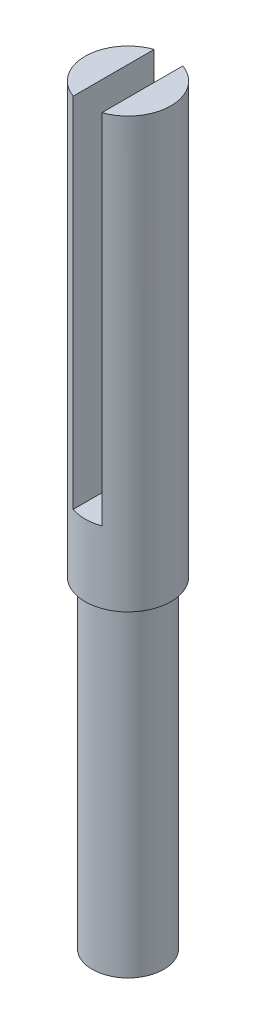
ISO-10303-21;
HEADER;
FILE_DESCRIPTION(('STEP AP214'),'2;1');
FILE_NAME('part.step','',(''),(''),'','','');
FILE_SCHEMA(('AUTOMOTIVE_DESIGN { 1 0 10303 214 1 1 1 1 }'));
ENDSEC;
DATA;
#1=APPLICATION_CONTEXT('core data for automotive mechanical design processes');
#2=APPLICATION_PROTOCOL_DEFINITION('international standard','automotive_design',2000,#1);
#3=PRODUCT_CONTEXT('',#1,'mechanical');
#4=PRODUCT('Part','Part','',(#3));
#5=PRODUCT_RELATED_PRODUCT_CATEGORY('part','',(#4));
#6=PRODUCT_DEFINITION_FORMATION('','',#4);
#7=PRODUCT_DEFINITION_CONTEXT('part definition',#1,'design');
#8=PRODUCT_DEFINITION('design','',#6,#7);
#9=PRODUCT_DEFINITION_SHAPE('','',#8);
#10=(LENGTH_UNIT() NAMED_UNIT(*) SI_UNIT(.MILLI.,.METRE.));
#11=(NAMED_UNIT(*) PLANE_ANGLE_UNIT() SI_UNIT($,.RADIAN.));
#12=(NAMED_UNIT(*) SI_UNIT($,.STERADIAN.) SOLID_ANGLE_UNIT());
#13=UNCERTAINTY_MEASURE_WITH_UNIT(LENGTH_MEASURE(1.E-05),#10,'distance_accuracy_value','');
#14=(GEOMETRIC_REPRESENTATION_CONTEXT(3) GLOBAL_UNCERTAINTY_ASSIGNED_CONTEXT((#13)) GLOBAL_UNIT_ASSIGNED_CONTEXT((#10,
#11,#12)) REPRESENTATION_CONTEXT('',''));
#15=CARTESIAN_POINT('',(0.,0.,0.));
#16=DIRECTION('',(0.,0.,1.));
#17=DIRECTION('',(1.,0.,0.));
#18=AXIS2_PLACEMENT_3D('',#15,#16,#17);
#19=CARTESIAN_POINT('',(0.,5.,0.));
#20=DIRECTION('',(0.,-1.,0.));
#21=DIRECTION('',(0.,0.,-1.));
#22=AXIS2_PLACEMENT_3D('',#19,#20,#21);
#23=CYLINDRICAL_SURFACE('',#22,6.);
#24=CARTESIAN_POINT('',(0.,-45.,0.));
#25=DIRECTION('',(0.,-1.,0.));
#26=DIRECTION('',(0.,0.,-1.));
#27=AXIS2_PLACEMENT_3D('',#24,#25,#26);
#28=CIRCLE('',#27,6.);
#29=CARTESIAN_POINT('',(-2.,-45.,-5.65685424949238));
#30=VERTEX_POINT('',#29);
#31=CARTESIAN_POINT('',(1.99999999999999,-45.,-5.65685424949238));
#32=VERTEX_POINT('',#31);
#33=EDGE_CURVE('E11',#30,#32,#28,.T.);
#34=ORIENTED_EDGE('',*,*,#33,.T.);
#35=DIRECTION('',(0.,-1.,0.));
#36=VECTOR('',#35,1.);
#37=CARTESIAN_POINT('',(2.,5.,-5.65685424949238));
#38=LINE('',#37,#36);
#39=CARTESIAN_POINT('',(2.,5.,-5.65685424949238));
#40=VERTEX_POINT('',#39);
#41=EDGE_CURVE('E77',#32,#40,#38,.F.);
#42=ORIENTED_EDGE('',*,*,#41,.T.);
#43=CARTESIAN_POINT('',(0.,5.,0.));
#44=DIRECTION('',(0.,1.,0.));
#45=DIRECTION('',(0.,0.,1.));
#46=AXIS2_PLACEMENT_3D('',#43,#44,#45);
#47=CIRCLE('',#46,6.);
#48=CARTESIAN_POINT('',(2.,5.,5.65685424949238));
#49=VERTEX_POINT('',#48);
#50=EDGE_CURVE('E82',#49,#40,#47,.T.);
#51=ORIENTED_EDGE('',*,*,#50,.F.);
#52=DIRECTION('',(0.,-1.,0.));
#53=VECTOR('',#52,1.);
#54=CARTESIAN_POINT('',(2.,5.,5.65685424949238));
#55=LINE('',#54,#53);
#56=CARTESIAN_POINT('',(1.99999999999999,-45.,5.65685424949238));
#57=VERTEX_POINT('',#56);
#58=EDGE_CURVE('E50',#49,#57,#55,.T.);
#59=ORIENTED_EDGE('',*,*,#58,.T.);
#60=CARTESIAN_POINT('',(-2.,-45.,5.65685424949238));
#61=VERTEX_POINT('',#60);
#62=EDGE_CURVE('E39',#57,#61,#28,.T.);
#63=ORIENTED_EDGE('',*,*,#62,.T.);
#64=DIRECTION('',(0.,-1.,0.));
#65=VECTOR('',#64,1.);
#66=CARTESIAN_POINT('',(-2.,5.,5.65685424949238));
#67=LINE('',#66,#65);
#68=CARTESIAN_POINT('',(-2.,5.,5.65685424949238));
#69=VERTEX_POINT('',#68);
#70=EDGE_CURVE('E98',#61,#69,#67,.F.);
#71=ORIENTED_EDGE('',*,*,#70,.T.);
#72=CARTESIAN_POINT('',(-2.,5.,-5.65685424949238));
#73=VERTEX_POINT('',#72);
#74=EDGE_CURVE('E90',#73,#69,#47,.T.);
#75=ORIENTED_EDGE('',*,*,#74,.F.);
#76=DIRECTION('',(0.,-1.,0.));
#77=VECTOR('',#76,1.);
#78=CARTESIAN_POINT('',(-2.,5.,-5.65685424949238));
#79=LINE('',#78,#77);
#80=EDGE_CURVE('E93',#73,#30,#79,.T.);
#81=ORIENTED_EDGE('',*,*,#80,.T.);
#82=EDGE_LOOP('',(#34,#42,#51,#59,#63,#71,#75,#81));
#83=FACE_BOUND('',#82,.T.);
#84=CARTESIAN_POINT('',(0.,-55.,0.));
#85=DIRECTION('',(0.,-1.,0.));
#86=DIRECTION('',(0.,0.,-1.));
#87=AXIS2_PLACEMENT_3D('',#84,#85,#86);
#88=CIRCLE('',#87,6.);
#89=CARTESIAN_POINT('',(0.,-55.,-6.));
#90=VERTEX_POINT('',#89);
#91=EDGE_CURVE('E105',#90,#90,#88,.T.);
#92=ORIENTED_EDGE('',*,*,#91,.F.);
#93=EDGE_LOOP('',(#92));
#94=FACE_BOUND('',#93,.T.);
#95=ADVANCED_FACE('F36',(#83,#94),#23,.T.);
#96=CARTESIAN_POINT('',(0.,5.,0.));
#97=DIRECTION('',(0.,1.,0.));
#98=DIRECTION('',(0.,0.,1.));
#99=AXIS2_PLACEMENT_3D('',#96,#97,#98);
#100=PLANE('',#99);
#101=DIRECTION('',(0.,0.,1.));
#102=VECTOR('',#101,1.);
#103=CARTESIAN_POINT('',(-2.,5.,0.));
#104=LINE('',#103,#102);
#105=EDGE_CURVE('E58',#73,#69,#104,.T.);
#106=ORIENTED_EDGE('',*,*,#105,.F.);
#107=ORIENTED_EDGE('',*,*,#74,.T.);
#108=EDGE_LOOP('',(#106,#107));
#109=FACE_BOUND('',#108,.T.);
#110=ADVANCED_FACE('F112',(#109),#100,.T.);
#111=DIRECTION('',(0.,0.,-1.));
#112=VECTOR('',#111,1.);
#113=CARTESIAN_POINT('',(2.,5.,0.));
#114=LINE('',#113,#112);
#115=EDGE_CURVE('E74',#49,#40,#114,.T.);
#116=ORIENTED_EDGE('',*,*,#115,.F.);
#117=ORIENTED_EDGE('',*,*,#50,.T.);
#118=EDGE_LOOP('',(#116,#117));
#119=FACE_BOUND('',#118,.T.);
#120=ADVANCED_FACE('F89',(#119),#100,.T.);
#121=CARTESIAN_POINT('',(-2.,-45.,-6.));
#122=DIRECTION('',(0.,-1.,0.));
#123=DIRECTION('',(0.,0.,-1.));
#124=AXIS2_PLACEMENT_3D('',#121,#122,#123);
#125=PLANE('',#124);
#126=DIRECTION('',(0.,0.,1.));
#127=VECTOR('',#126,1.);
#128=CARTESIAN_POINT('',(1.99999999999999,-45.,-6.));
#129=LINE('',#128,#127);
#130=EDGE_CURVE('E87',#32,#57,#129,.T.);
#131=ORIENTED_EDGE('',*,*,#130,.F.);
#132=ORIENTED_EDGE('',*,*,#33,.F.);
#133=DIRECTION('',(0.,0.,1.));
#134=VECTOR('',#133,1.);
#135=CARTESIAN_POINT('',(-2.,-45.,-6.));
#136=LINE('',#135,#134);
#137=EDGE_CURVE('E103',#30,#61,#136,.T.);
#138=ORIENTED_EDGE('',*,*,#137,.T.);
#139=ORIENTED_EDGE('',*,*,#62,.F.);
#140=EDGE_LOOP('',(#131,#132,#138,#139));
#141=FACE_BOUND('',#140,.T.);
#142=ADVANCED_FACE('F101',(#141),#125,.F.);
#143=CARTESIAN_POINT('',(-2.,5.,-6.));
#144=DIRECTION('',(-1.,0.,0.));
#145=DIRECTION('',(0.,0.,1.));
#146=AXIS2_PLACEMENT_3D('',#143,#144,#145);
#147=PLANE('',#146);
#148=ORIENTED_EDGE('',*,*,#105,.T.);
#149=ORIENTED_EDGE('',*,*,#70,.F.);
#150=ORIENTED_EDGE('',*,*,#137,.F.);
#151=ORIENTED_EDGE('',*,*,#80,.F.);
#152=EDGE_LOOP('',(#148,#149,#150,#151));
#153=FACE_BOUND('',#152,.T.);
#154=ADVANCED_FACE('F110',(#153),#147,.F.);
#155=CARTESIAN_POINT('',(2.,5.,-6.));
#156=DIRECTION('',(1.,0.,0.));
#157=DIRECTION('',(0.,1.,0.));
#158=AXIS2_PLACEMENT_3D('',#155,#156,#157);
#159=PLANE('',#158);
#160=ORIENTED_EDGE('',*,*,#115,.T.);
#161=ORIENTED_EDGE('',*,*,#41,.F.);
#162=ORIENTED_EDGE('',*,*,#130,.T.);
#163=ORIENTED_EDGE('',*,*,#58,.F.);
#164=EDGE_LOOP('',(#160,#161,#162,#163));
#165=FACE_BOUND('',#164,.T.);
#166=ADVANCED_FACE('F76',(#165),#159,.F.);
#167=CARTESIAN_POINT('',(0.,-55.,0.));
#168=DIRECTION('',(0.,-1.,0.));
#169=DIRECTION('',(0.,0.,-1.));
#170=AXIS2_PLACEMENT_3D('',#167,#168,#169);
#171=PLANE('',#170);
#172=CARTESIAN_POINT('',(0.,-55.,0.));
#173=DIRECTION('',(0.,-1.,0.));
#174=DIRECTION('',(0.,0.,-1.));
#175=AXIS2_PLACEMENT_3D('',#172,#173,#174);
#176=CIRCLE('',#175,5.);
#177=CARTESIAN_POINT('',(0.,-55.,-5.));
#178=VERTEX_POINT('',#177);
#179=EDGE_CURVE('E141',#178,#178,#176,.T.);
#180=ORIENTED_EDGE('',*,*,#179,.F.);
#181=EDGE_LOOP('',(#180));
#182=FACE_BOUND('',#181,.T.);
#183=ORIENTED_EDGE('',*,*,#91,.T.);
#184=EDGE_LOOP('',(#183));
#185=FACE_BOUND('',#184,.T.);
#186=ADVANCED_FACE('F130',(#182,#185),#171,.T.);
#187=CARTESIAN_POINT('',(0.,-55.,0.));
#188=DIRECTION('',(0.,-1.,0.));
#189=DIRECTION('',(0.,0.,-1.));
#190=AXIS2_PLACEMENT_3D('',#187,#188,#189);
#191=CYLINDRICAL_SURFACE('',#190,5.);
#192=CARTESIAN_POINT('',(0.,-100.,0.));
#193=DIRECTION('',(0.,-1.,0.));
#194=DIRECTION('',(0.,0.,-1.));
#195=AXIS2_PLACEMENT_3D('',#192,#193,#194);
#196=CIRCLE('',#195,5.);
#197=CARTESIAN_POINT('',(0.,-100.,-5.));
#198=VERTEX_POINT('',#197);
#199=EDGE_CURVE('E144',#198,#198,#196,.T.);
#200=CARTESIAN_POINT('',(0.,-55.,-5.));
#201=CARTESIAN_POINT('',(0.,-55.46875,-5.));
#202=CARTESIAN_POINT('',(0.,-55.9375,-5.));
#203=CARTESIAN_POINT('',(0.,-56.875,-5.));
#204=CARTESIAN_POINT('',(0.,-57.34375,-5.));
#205=CARTESIAN_POINT('',(0.,-58.28125,-5.));
#206=CARTESIAN_POINT('',(0.,-58.75,-5.));
#207=CARTESIAN_POINT('',(0.,-59.6875,-5.));
#208=CARTESIAN_POINT('',(0.,-60.15625,-5.));
#209=CARTESIAN_POINT('',(0.,-61.09375,-5.));
#210=CARTESIAN_POINT('',(0.,-61.5625,-5.));
#211=CARTESIAN_POINT('',(0.,-62.5,-5.));
#212=CARTESIAN_POINT('',(0.,-62.96875,-5.));
#213=CARTESIAN_POINT('',(0.,-63.90625,-5.));
#214=CARTESIAN_POINT('',(0.,-64.375,-5.));
#215=CARTESIAN_POINT('',(0.,-65.3125,-5.));
#216=CARTESIAN_POINT('',(0.,-65.78125,-5.));
#217=CARTESIAN_POINT('',(0.,-66.71875,-5.));
#218=CARTESIAN_POINT('',(0.,-67.1875,-5.));
#219=CARTESIAN_POINT('',(0.,-68.125,-5.));
#220=CARTESIAN_POINT('',(0.,-68.59375,-5.));
#221=CARTESIAN_POINT('',(0.,-69.53125,-5.));
#222=CARTESIAN_POINT('',(0.,-70.,-5.));
#223=CARTESIAN_POINT('',(0.,-70.9375,-5.));
#224=CARTESIAN_POINT('',(0.,-71.40625,-5.));
#225=CARTESIAN_POINT('',(0.,-72.34375,-5.));
#226=CARTESIAN_POINT('',(0.,-72.8125,-5.));
#227=CARTESIAN_POINT('',(0.,-73.75,-5.));
#228=CARTESIAN_POINT('',(0.,-74.21875,-5.));
#229=CARTESIAN_POINT('',(0.,-75.15625,-5.));
#230=CARTESIAN_POINT('',(0.,-75.625,-5.));
#231=CARTESIAN_POINT('',(0.,-76.5625,-5.));
#232=CARTESIAN_POINT('',(0.,-77.03125,-5.));
#233=CARTESIAN_POINT('',(0.,-77.96875,-5.));
#234=CARTESIAN_POINT('',(0.,-78.4375,-5.));
#235=CARTESIAN_POINT('',(0.,-79.375,-5.));
#236=CARTESIAN_POINT('',(0.,-79.84375,-5.));
#237=CARTESIAN_POINT('',(0.,-80.78125,-5.));
#238=CARTESIAN_POINT('',(0.,-81.25,-5.));
#239=CARTESIAN_POINT('',(0.,-82.1875,-5.));
#240=CARTESIAN_POINT('',(0.,-82.65625,-5.));
#241=CARTESIAN_POINT('',(0.,-83.59375,-5.));
#242=CARTESIAN_POINT('',(0.,-84.0625,-5.));
#243=CARTESIAN_POINT('',(0.,-85.,-5.));
#244=CARTESIAN_POINT('',(0.,-85.46875,-5.));
#245=CARTESIAN_POINT('',(0.,-86.40625,-5.));
#246=CARTESIAN_POINT('',(0.,-86.875,-5.));
#247=CARTESIAN_POINT('',(0.,-87.8125,-5.));
#248=CARTESIAN_POINT('',(0.,-88.28125,-5.));
#249=CARTESIAN_POINT('',(0.,-89.21875,-5.));
#250=CARTESIAN_POINT('',(0.,-89.6875,-5.));
#251=CARTESIAN_POINT('',(0.,-90.625,-5.));
#252=CARTESIAN_POINT('',(0.,-91.09375,-5.));
#253=CARTESIAN_POINT('',(0.,-92.03125,-5.));
#254=CARTESIAN_POINT('',(0.,-92.5,-5.));
#255=CARTESIAN_POINT('',(0.,-93.4375,-5.));
#256=CARTESIAN_POINT('',(0.,-93.90625,-5.));
#257=CARTESIAN_POINT('',(0.,-94.84375,-5.));
#258=CARTESIAN_POINT('',(0.,-95.3125,-5.));
#259=CARTESIAN_POINT('',(0.,-96.25,-5.));
#260=CARTESIAN_POINT('',(0.,-96.71875,-5.));
#261=CARTESIAN_POINT('',(0.,-97.65625,-5.));
#262=CARTESIAN_POINT('',(0.,-98.125,-5.));
#263=CARTESIAN_POINT('',(0.,-99.0625,-5.));
#264=CARTESIAN_POINT('',(0.,-99.53125,-5.));
#265=CARTESIAN_POINT('',(0.,-100.,-5.));
#266=B_SPLINE_CURVE_WITH_KNOTS('',3,(#200,#201,#202,#203,#204,#205,#206,#207,#208,#209,#210,
#211,#212,#213,#214,#215,#216,#217,#218,#219,#220,#221,#222,#223,#224,#225,#226,#227,#228,#229,
#230,#231,#232,#233,#234,#235,#236,#237,#238,#239,#240,#241,#242,#243,#244,#245,#246,#247,#248,
#249,#250,#251,#252,#253,#254,#255,#256,#257,#258,#259,#260,#261,#262,#263,#264,#265),
.UNSPECIFIED.,.F.,.F.,(4,2,2,2,2,2,2,2,2,2,2,2,2,2,2,2,2,2,2,2,2,2,2,2,2,2,2,2,2,2,2,2,4),(0.,
1.40625,2.8125,4.21875,5.62500000000001,7.03125,8.43750000000001,9.84375000000001,11.25,
12.65625,14.0625,15.46875,16.875,18.28125,19.6875,21.09375,22.5,23.90625,25.3125,26.71875,
28.125,29.53125,30.9375,32.34375,33.75,35.15625,36.5625,37.96875,39.375,40.78125,42.1875,
43.59375,45.),.UNSPECIFIED.);
#267=EDGE_CURVE('BSEAM122',#178,#198,#266,.T.);
#268=ORIENTED_EDGE('',*,*,#179,.T.);
#269=ORIENTED_EDGE('',*,*,#199,.F.);
#270=ORIENTED_EDGE('',*,*,#267,.T.);
#271=ORIENTED_EDGE('',*,*,#267,.F.);
#272=EDGE_LOOP('',(#268,#270,#269,#271));
#273=FACE_BOUND('',#272,.T.);
#274=ADVANCED_FACE('F122',(#273),#191,.T.);
#275=CARTESIAN_POINT('',(0.,-100.,0.));
#276=DIRECTION('',(0.,-1.,0.));
#277=DIRECTION('',(0.,0.,-1.));
#278=AXIS2_PLACEMENT_3D('',#275,#276,#277);
#279=PLANE('',#278);
#280=ORIENTED_EDGE('',*,*,#199,.T.);
#281=EDGE_LOOP('',(#280));
#282=FACE_BOUND('',#281,.T.);
#283=ADVANCED_FACE('F119',(#282),#279,.T.);
#284=CLOSED_SHELL('',(#95,#110,#120,#142,#154,#166,#186,#274,#283));
#285=MANIFOLD_SOLID_BREP('B2',#284);
#286=ADVANCED_BREP_SHAPE_REPRESENTATION('',(#18,#285),#14);
#287=SHAPE_DEFINITION_REPRESENTATION(#9,#286);
ENDSEC;
END-ISO-10303-21;
